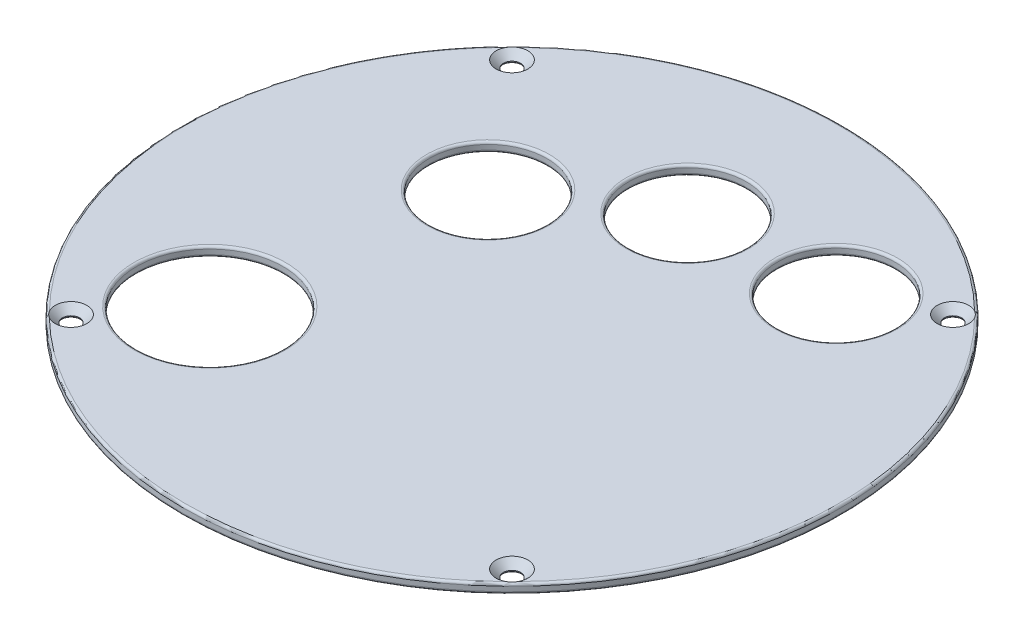
ISO-10303-21;
HEADER;
FILE_DESCRIPTION(('STEP AP214'),'2;1');
FILE_NAME('part.step','',(''),(''),'','','');
FILE_SCHEMA(('AUTOMOTIVE_DESIGN { 1 0 10303 214 1 1 1 1 }'));
ENDSEC;
DATA;
#1=APPLICATION_CONTEXT('core data for automotive mechanical design processes');
#2=APPLICATION_PROTOCOL_DEFINITION('international standard','automotive_design',2000,#1);
#3=PRODUCT_CONTEXT('',#1,'mechanical');
#4=PRODUCT('Part','Part','',(#3));
#5=PRODUCT_RELATED_PRODUCT_CATEGORY('part','',(#4));
#6=PRODUCT_DEFINITION_FORMATION('','',#4);
#7=PRODUCT_DEFINITION_CONTEXT('part definition',#1,'design');
#8=PRODUCT_DEFINITION('design','',#6,#7);
#9=PRODUCT_DEFINITION_SHAPE('','',#8);
#10=(LENGTH_UNIT() NAMED_UNIT(*) SI_UNIT(.MILLI.,.METRE.));
#11=(NAMED_UNIT(*) PLANE_ANGLE_UNIT() SI_UNIT($,.RADIAN.));
#12=(NAMED_UNIT(*) SI_UNIT($,.STERADIAN.) SOLID_ANGLE_UNIT());
#13=UNCERTAINTY_MEASURE_WITH_UNIT(LENGTH_MEASURE(1.E-05),#10,'distance_accuracy_value','');
#14=(GEOMETRIC_REPRESENTATION_CONTEXT(3) GLOBAL_UNCERTAINTY_ASSIGNED_CONTEXT((#13)) GLOBAL_UNIT_ASSIGNED_CONTEXT((#10,
#11,#12)) REPRESENTATION_CONTEXT('',''));
#15=CARTESIAN_POINT('',(0.,0.,0.));
#16=DIRECTION('',(0.,0.,1.));
#17=DIRECTION('',(1.,0.,0.));
#18=AXIS2_PLACEMENT_3D('',#15,#16,#17);
#19=CARTESIAN_POINT('',(-25.,2.,-20.));
#20=DIRECTION('',(0.,-1.,0.));
#21=DIRECTION('',(0.,0.,-1.));
#22=AXIS2_PLACEMENT_3D('',#19,#20,#21);
#23=CYLINDRICAL_SURFACE('',#22,12.3);
#24=CARTESIAN_POINT('',(-25.,0.5,-20.));
#25=DIRECTION('',(0.,1.,0.));
#26=DIRECTION('',(0.,0.,1.));
#27=AXIS2_PLACEMENT_3D('',#24,#25,#26);
#28=CIRCLE('',#27,12.3);
#29=CARTESIAN_POINT('',(-25.,0.5,-7.69999999999999));
#30=VERTEX_POINT('',#29);
#31=EDGE_CURVE('E145',#30,#30,#28,.F.);
#32=ORIENTED_EDGE('',*,*,#31,.T.);
#33=EDGE_LOOP('',(#32));
#34=FACE_BOUND('',#33,.T.);
#35=CARTESIAN_POINT('',(-25.,1.5,-20.));
#36=DIRECTION('',(0.,1.,0.));
#37=DIRECTION('',(0.,0.,1.));
#38=AXIS2_PLACEMENT_3D('',#35,#36,#37);
#39=CIRCLE('',#38,12.3);
#40=CARTESIAN_POINT('',(-25.,1.5,-7.69999999999999));
#41=VERTEX_POINT('',#40);
#42=EDGE_CURVE('E136',#41,#41,#39,.T.);
#43=ORIENTED_EDGE('',*,*,#42,.T.);
#44=EDGE_LOOP('',(#43));
#45=FACE_BOUND('',#44,.T.);
#46=ADVANCED_FACE('F43',(#34,#45),#23,.F.);
#47=CARTESIAN_POINT('',(0.,2.,-36.583123951777));
#48=DIRECTION('',(0.,-1.,0.));
#49=DIRECTION('',(0.,0.,-1.));
#50=AXIS2_PLACEMENT_3D('',#47,#48,#49);
#51=CYLINDRICAL_SURFACE('',#50,12.3);
#52=CARTESIAN_POINT('',(0.,0.5,-36.583123951777));
#53=DIRECTION('',(0.,1.,0.));
#54=DIRECTION('',(0.,0.,1.));
#55=AXIS2_PLACEMENT_3D('',#52,#53,#54);
#56=CIRCLE('',#55,12.3);
#57=CARTESIAN_POINT('',(0.,0.5,-24.283123951777));
#58=VERTEX_POINT('',#57);
#59=EDGE_CURVE('E137',#58,#58,#56,.F.);
#60=ORIENTED_EDGE('',*,*,#59,.T.);
#61=EDGE_LOOP('',(#60));
#62=FACE_BOUND('',#61,.T.);
#63=CARTESIAN_POINT('',(0.,1.5,-36.583123951777));
#64=DIRECTION('',(0.,1.,0.));
#65=DIRECTION('',(0.,0.,1.));
#66=AXIS2_PLACEMENT_3D('',#63,#64,#65);
#67=CIRCLE('',#66,12.3);
#68=CARTESIAN_POINT('',(0.,1.5,-24.283123951777));
#69=VERTEX_POINT('',#68);
#70=EDGE_CURVE('E135',#69,#69,#67,.T.);
#71=ORIENTED_EDGE('',*,*,#70,.T.);
#72=EDGE_LOOP('',(#71));
#73=FACE_BOUND('',#72,.T.);
#74=ADVANCED_FACE('F238',(#62,#73),#51,.F.);
#75=CARTESIAN_POINT('',(30.,2.,-37.583123951777));
#76=DIRECTION('',(0.,-1.,0.));
#77=DIRECTION('',(0.,0.,-1.));
#78=AXIS2_PLACEMENT_3D('',#75,#76,#77);
#79=CYLINDRICAL_SURFACE('',#78,12.3);
#80=CARTESIAN_POINT('',(30.,0.5,-37.583123951777));
#81=DIRECTION('',(0.,1.,0.));
#82=DIRECTION('',(0.,0.,1.));
#83=AXIS2_PLACEMENT_3D('',#80,#81,#82);
#84=CIRCLE('',#83,12.3);
#85=CARTESIAN_POINT('',(30.,0.5,-25.283123951777));
#86=VERTEX_POINT('',#85);
#87=EDGE_CURVE('E129',#86,#86,#84,.F.);
#88=ORIENTED_EDGE('',*,*,#87,.T.);
#89=EDGE_LOOP('',(#88));
#90=FACE_BOUND('',#89,.T.);
#91=CARTESIAN_POINT('',(30.,1.5,-37.583123951777));
#92=DIRECTION('',(0.,1.,0.));
#93=DIRECTION('',(0.,0.,1.));
#94=AXIS2_PLACEMENT_3D('',#91,#92,#93);
#95=CIRCLE('',#94,12.3);
#96=CARTESIAN_POINT('',(30.,1.5,-25.283123951777));
#97=VERTEX_POINT('',#96);
#98=EDGE_CURVE('E130',#97,#97,#95,.T.);
#99=ORIENTED_EDGE('',*,*,#98,.T.);
#100=EDGE_LOOP('',(#99));
#101=FACE_BOUND('',#100,.T.);
#102=ADVANCED_FACE('F242',(#90,#101),#79,.F.);
#103=CARTESIAN_POINT('',(-33.,2.,30.));
#104=DIRECTION('',(0.,-1.,0.));
#105=DIRECTION('',(0.,0.,-1.));
#106=AXIS2_PLACEMENT_3D('',#103,#104,#105);
#107=CYLINDRICAL_SURFACE('',#106,15.3);
#108=CARTESIAN_POINT('',(-33.,0.5,30.));
#109=DIRECTION('',(0.,1.,0.));
#110=DIRECTION('',(0.,0.,1.));
#111=AXIS2_PLACEMENT_3D('',#108,#109,#110);
#112=CIRCLE('',#111,15.3);
#113=CARTESIAN_POINT('',(-33.,0.5,45.3));
#114=VERTEX_POINT('',#113);
#115=EDGE_CURVE('E105',#114,#114,#112,.F.);
#116=ORIENTED_EDGE('',*,*,#115,.T.);
#117=EDGE_LOOP('',(#116));
#118=FACE_BOUND('',#117,.T.);
#119=CARTESIAN_POINT('',(-33.,1.5,30.));
#120=DIRECTION('',(0.,1.,0.));
#121=DIRECTION('',(0.,0.,1.));
#122=AXIS2_PLACEMENT_3D('',#119,#120,#121);
#123=CIRCLE('',#122,15.3);
#124=CARTESIAN_POINT('',(-33.,1.5,45.3));
#125=VERTEX_POINT('',#124);
#126=EDGE_CURVE('E110',#125,#125,#123,.T.);
#127=ORIENTED_EDGE('',*,*,#126,.T.);
#128=EDGE_LOOP('',(#127));
#129=FACE_BOUND('',#128,.T.);
#130=ADVANCED_FACE('F251',(#118,#129),#107,.F.);
#131=CARTESIAN_POINT('',(0.,2.,0.));
#132=DIRECTION('',(0.,-1.,0.));
#133=DIRECTION('',(0.,0.,-1.));
#134=AXIS2_PLACEMENT_3D('',#131,#132,#133);
#135=CYLINDRICAL_SURFACE('',#134,68.7);
#136=CARTESIAN_POINT('',(0.,0.5,0.));
#137=DIRECTION('',(0.,1.,0.));
#138=DIRECTION('',(0.,0.,1.));
#139=AXIS2_PLACEMENT_3D('',#136,#137,#138);
#140=CIRCLE('',#139,68.7);
#141=CARTESIAN_POINT('',(0.,0.5,68.7));
#142=VERTEX_POINT('',#141);
#143=EDGE_CURVE('E147',#142,#142,#140,.T.);
#144=ORIENTED_EDGE('',*,*,#143,.T.);
#145=EDGE_LOOP('',(#144));
#146=FACE_BOUND('',#145,.T.);
#147=CARTESIAN_POINT('',(0.,1.5,0.));
#148=DIRECTION('',(0.,1.,0.));
#149=DIRECTION('',(0.,0.,1.));
#150=AXIS2_PLACEMENT_3D('',#147,#148,#149);
#151=CIRCLE('',#150,68.7);
#152=CARTESIAN_POINT('',(0.,1.5,68.7));
#153=VERTEX_POINT('',#152);
#154=EDGE_CURVE('E143',#153,#153,#151,.F.);
#155=ORIENTED_EDGE('',*,*,#154,.T.);
#156=EDGE_LOOP('',(#155));
#157=FACE_BOUND('',#156,.T.);
#158=ADVANCED_FACE('F248',(#146,#157),#135,.T.);
#159=CARTESIAN_POINT('',(0.,2.,0.));
#160=DIRECTION('',(0.,1.,0.));
#161=DIRECTION('',(0.,0.,1.));
#162=AXIS2_PLACEMENT_3D('',#159,#160,#161);
#163=PLANE('',#162);
#164=CARTESIAN_POINT('',(-33.,2.,30.));
#165=DIRECTION('',(0.,1.,0.));
#166=DIRECTION('',(0.,0.,1.));
#167=AXIS2_PLACEMENT_3D('',#164,#165,#166);
#168=CIRCLE('',#167,15.8);
#169=CARTESIAN_POINT('',(-33.,2.,45.8));
#170=VERTEX_POINT('',#169);
#171=EDGE_CURVE('E121',#170,#170,#168,.F.);
#172=ORIENTED_EDGE('',*,*,#171,.T.);
#173=EDGE_LOOP('',(#172));
#174=FACE_BOUND('',#173,.T.);
#175=CARTESIAN_POINT('',(30.,2.,-37.583123951777));
#176=DIRECTION('',(0.,1.,0.));
#177=DIRECTION('',(0.,0.,1.));
#178=AXIS2_PLACEMENT_3D('',#175,#176,#177);
#179=CIRCLE('',#178,12.8);
#180=CARTESIAN_POINT('',(30.,2.,-24.783123951777));
#181=VERTEX_POINT('',#180);
#182=EDGE_CURVE('E122',#181,#181,#179,.F.);
#183=ORIENTED_EDGE('',*,*,#182,.T.);
#184=EDGE_LOOP('',(#183));
#185=FACE_BOUND('',#184,.T.);
#186=CARTESIAN_POINT('',(0.,2.,-36.583123951777));
#187=DIRECTION('',(0.,1.,0.));
#188=DIRECTION('',(0.,0.,1.));
#189=AXIS2_PLACEMENT_3D('',#186,#187,#188);
#190=CIRCLE('',#189,12.8);
#191=CARTESIAN_POINT('',(0.,2.,-23.783123951777));
#192=VERTEX_POINT('',#191);
#193=EDGE_CURVE('E117',#192,#192,#190,.F.);
#194=ORIENTED_EDGE('',*,*,#193,.T.);
#195=EDGE_LOOP('',(#194));
#196=FACE_BOUND('',#195,.T.);
#197=CARTESIAN_POINT('',(-25.,2.,-20.));
#198=DIRECTION('',(0.,1.,0.));
#199=DIRECTION('',(0.,0.,1.));
#200=AXIS2_PLACEMENT_3D('',#197,#198,#199);
#201=CIRCLE('',#200,12.8);
#202=CARTESIAN_POINT('',(-25.,2.,-7.19999999999999));
#203=VERTEX_POINT('',#202);
#204=EDGE_CURVE('E114',#203,#203,#201,.F.);
#205=ORIENTED_EDGE('',*,*,#204,.T.);
#206=EDGE_LOOP('',(#205));
#207=FACE_BOUND('',#206,.T.);
#208=CARTESIAN_POINT('',(45.9619407771255,2.,-45.9619407771257));
#209=DIRECTION('',(0.,1.,0.));
#210=DIRECTION('',(0.,0.,1.));
#211=AXIS2_PLACEMENT_3D('',#208,#209,#210);
#212=CIRCLE('',#211,3.3);
#213=CARTESIAN_POINT('',(48.8050882928111,2.,-47.6372055932221));
#214=VERTEX_POINT('',#213);
#215=CARTESIAN_POINT('',(47.6372055932219,2.,-48.8050882928113));
#216=VERTEX_POINT('',#215);
#217=EDGE_CURVE('E339',#214,#216,#212,.F.);
#218=ORIENTED_EDGE('',*,*,#217,.T.);
#219=CARTESIAN_POINT('',(0.,2.,0.));
#220=DIRECTION('',(0.,1.,0.));
#221=DIRECTION('',(0.,0.,1.));
#222=AXIS2_PLACEMENT_3D('',#219,#220,#221);
#223=CIRCLE('',#222,68.2);
#224=CARTESIAN_POINT('',(-47.6372055932221,2.,-48.8050882928111));
#225=VERTEX_POINT('',#224);
#226=EDGE_CURVE('E115',#216,#225,#223,.T.);
#227=ORIENTED_EDGE('',*,*,#226,.T.);
#228=CARTESIAN_POINT('',(-45.9619407771257,2.,-45.9619407771255));
#229=DIRECTION('',(0.,1.,0.));
#230=DIRECTION('',(0.,0.,1.));
#231=AXIS2_PLACEMENT_3D('',#228,#229,#230);
#232=CIRCLE('',#231,3.3);
#233=CARTESIAN_POINT('',(-48.8050882928113,2.,-47.6372055932219));
#234=VERTEX_POINT('',#233);
#235=EDGE_CURVE('E337',#225,#234,#232,.F.);
#236=ORIENTED_EDGE('',*,*,#235,.T.);
#237=CARTESIAN_POINT('',(0.,2.,0.));
#238=DIRECTION('',(0.,1.,0.));
#239=DIRECTION('',(0.,0.,1.));
#240=AXIS2_PLACEMENT_3D('',#237,#238,#239);
#241=CIRCLE('',#240,68.2);
#242=CARTESIAN_POINT('',(-48.8050882928113,2.,47.6372055932219));
#243=VERTEX_POINT('',#242);
#244=EDGE_CURVE('E104',#234,#243,#241,.T.);
#245=ORIENTED_EDGE('',*,*,#244,.T.);
#246=CARTESIAN_POINT('',(-45.9619407771255,2.,45.9619407771257));
#247=DIRECTION('',(0.,1.,0.));
#248=DIRECTION('',(0.,0.,1.));
#249=AXIS2_PLACEMENT_3D('',#246,#247,#248);
#250=CIRCLE('',#249,3.30000000000005);
#251=CARTESIAN_POINT('',(-47.6372055932217,2.,48.8050882928115));
#252=VERTEX_POINT('',#251);
#253=EDGE_CURVE('E100',#243,#252,#250,.F.);
#254=ORIENTED_EDGE('',*,*,#253,.T.);
#255=CARTESIAN_POINT('',(0.,2.,0.));
#256=DIRECTION('',(0.,1.,0.));
#257=DIRECTION('',(0.,0.,1.));
#258=AXIS2_PLACEMENT_3D('',#255,#256,#257);
#259=CIRCLE('',#258,68.2);
#260=CARTESIAN_POINT('',(47.6372055932221,2.,48.8050882928112));
#261=VERTEX_POINT('',#260);
#262=EDGE_CURVE('E97',#252,#261,#259,.T.);
#263=ORIENTED_EDGE('',*,*,#262,.T.);
#264=CARTESIAN_POINT('',(45.9619407771257,2.,45.9619407771255));
#265=DIRECTION('',(0.,1.,0.));
#266=DIRECTION('',(0.,0.,1.));
#267=AXIS2_PLACEMENT_3D('',#264,#265,#266);
#268=CIRCLE('',#267,3.3);
#269=CARTESIAN_POINT('',(48.8050882928114,2.,47.6372055932218));
#270=VERTEX_POINT('',#269);
#271=EDGE_CURVE('E92',#261,#270,#268,.F.);
#272=ORIENTED_EDGE('',*,*,#271,.T.);
#273=CARTESIAN_POINT('',(0.,2.,0.));
#274=DIRECTION('',(0.,1.,0.));
#275=DIRECTION('',(0.,0.,1.));
#276=AXIS2_PLACEMENT_3D('',#273,#274,#275);
#277=CIRCLE('',#276,68.2);
#278=EDGE_CURVE('E63',#270,#214,#277,.T.);
#279=ORIENTED_EDGE('',*,*,#278,.T.);
#280=EDGE_LOOP('',(#218,#227,#236,#245,#254,#263,#272,#279));
#281=FACE_BOUND('',#280,.T.);
#282=ADVANCED_FACE('F93',(#174,#185,#196,#207,#281),#163,.T.);
#283=CARTESIAN_POINT('',(0.,0.,0.));
#284=DIRECTION('',(0.,1.,0.));
#285=DIRECTION('',(0.,0.,1.));
#286=AXIS2_PLACEMENT_3D('',#283,#284,#285);
#287=PLANE('',#286);
#288=CARTESIAN_POINT('',(-45.9619407771257,0.,-45.9619407771255));
#289=DIRECTION('',(0.,1.,0.));
#290=DIRECTION('',(0.,0.,1.));
#291=AXIS2_PLACEMENT_3D('',#288,#289,#290);
#292=CIRCLE('',#291,2.3);
#293=CARTESIAN_POINT('',(-45.9619407771257,0.,-43.6619407771255));
#294=VERTEX_POINT('',#293);
#295=EDGE_CURVE('E281',#294,#294,#292,.T.);
#296=ORIENTED_EDGE('',*,*,#295,.T.);
#297=EDGE_LOOP('',(#296));
#298=FACE_BOUND('',#297,.T.);
#299=CARTESIAN_POINT('',(45.9619407771255,0.,-45.9619407771257));
#300=DIRECTION('',(0.,1.,0.));
#301=DIRECTION('',(0.,0.,1.));
#302=AXIS2_PLACEMENT_3D('',#299,#300,#301);
#303=CIRCLE('',#302,2.29999999999999);
#304=CARTESIAN_POINT('',(45.9619407771255,0.,-43.6619407771257));
#305=VERTEX_POINT('',#304);
#306=EDGE_CURVE('E287',#305,#305,#303,.T.);
#307=ORIENTED_EDGE('',*,*,#306,.T.);
#308=EDGE_LOOP('',(#307));
#309=FACE_BOUND('',#308,.T.);
#310=CARTESIAN_POINT('',(45.9619407771257,0.,45.9619407771255));
#311=DIRECTION('',(0.,1.,0.));
#312=DIRECTION('',(0.,0.,1.));
#313=AXIS2_PLACEMENT_3D('',#310,#311,#312);
#314=CIRCLE('',#313,2.3);
#315=CARTESIAN_POINT('',(45.9619407771257,0.,48.2619407771255));
#316=VERTEX_POINT('',#315);
#317=EDGE_CURVE('E288',#316,#316,#314,.T.);
#318=ORIENTED_EDGE('',*,*,#317,.T.);
#319=EDGE_LOOP('',(#318));
#320=FACE_BOUND('',#319,.T.);
#321=CARTESIAN_POINT('',(-45.9619407771255,0.,45.9619407771257));
#322=DIRECTION('',(0.,1.,0.));
#323=DIRECTION('',(0.,0.,1.));
#324=AXIS2_PLACEMENT_3D('',#321,#322,#323);
#325=CIRCLE('',#324,2.3);
#326=CARTESIAN_POINT('',(-45.9619407771255,0.,48.2619407771257));
#327=VERTEX_POINT('',#326);
#328=EDGE_CURVE('E295',#327,#327,#325,.T.);
#329=ORIENTED_EDGE('',*,*,#328,.T.);
#330=EDGE_LOOP('',(#329));
#331=FACE_BOUND('',#330,.T.);
#332=CARTESIAN_POINT('',(-33.,0.,30.));
#333=DIRECTION('',(0.,1.,0.));
#334=DIRECTION('',(0.,0.,1.));
#335=AXIS2_PLACEMENT_3D('',#332,#333,#334);
#336=CIRCLE('',#335,15.8);
#337=CARTESIAN_POINT('',(-33.,0.,45.8));
#338=VERTEX_POINT('',#337);
#339=EDGE_CURVE('E296',#338,#338,#336,.T.);
#340=ORIENTED_EDGE('',*,*,#339,.T.);
#341=EDGE_LOOP('',(#340));
#342=FACE_BOUND('',#341,.T.);
#343=CARTESIAN_POINT('',(30.,0.,-37.583123951777));
#344=DIRECTION('',(0.,1.,0.));
#345=DIRECTION('',(0.,0.,1.));
#346=AXIS2_PLACEMENT_3D('',#343,#344,#345);
#347=CIRCLE('',#346,12.8);
#348=CARTESIAN_POINT('',(30.,0.,-24.783123951777));
#349=VERTEX_POINT('',#348);
#350=EDGE_CURVE('E305',#349,#349,#347,.T.);
#351=ORIENTED_EDGE('',*,*,#350,.T.);
#352=EDGE_LOOP('',(#351));
#353=FACE_BOUND('',#352,.T.);
#354=CARTESIAN_POINT('',(0.,0.,-36.583123951777));
#355=DIRECTION('',(0.,1.,0.));
#356=DIRECTION('',(0.,0.,1.));
#357=AXIS2_PLACEMENT_3D('',#354,#355,#356);
#358=CIRCLE('',#357,12.8);
#359=CARTESIAN_POINT('',(0.,0.,-23.783123951777));
#360=VERTEX_POINT('',#359);
#361=EDGE_CURVE('E306',#360,#360,#358,.T.);
#362=ORIENTED_EDGE('',*,*,#361,.T.);
#363=EDGE_LOOP('',(#362));
#364=FACE_BOUND('',#363,.T.);
#365=CARTESIAN_POINT('',(-25.,0.,-20.));
#366=DIRECTION('',(0.,1.,0.));
#367=DIRECTION('',(0.,0.,1.));
#368=AXIS2_PLACEMENT_3D('',#365,#366,#367);
#369=CIRCLE('',#368,12.8);
#370=CARTESIAN_POINT('',(-25.,0.,-7.19999999999999));
#371=VERTEX_POINT('',#370);
#372=EDGE_CURVE('E309',#371,#371,#369,.T.);
#373=ORIENTED_EDGE('',*,*,#372,.T.);
#374=EDGE_LOOP('',(#373));
#375=FACE_BOUND('',#374,.T.);
#376=CARTESIAN_POINT('',(0.,0.,0.));
#377=DIRECTION('',(0.,1.,0.));
#378=DIRECTION('',(0.,0.,1.));
#379=AXIS2_PLACEMENT_3D('',#376,#377,#378);
#380=CIRCLE('',#379,68.2);
#381=CARTESIAN_POINT('',(0.,0.,68.2));
#382=VERTEX_POINT('',#381);
#383=EDGE_CURVE('E315',#382,#382,#380,.F.);
#384=ORIENTED_EDGE('',*,*,#383,.T.);
#385=EDGE_LOOP('',(#384));
#386=FACE_BOUND('',#385,.T.);
#387=ADVANCED_FACE('F265',(#298,#309,#320,#331,#342,#353,#364,#375,#386),#287,.F.);
#388=CARTESIAN_POINT('',(45.9619407771257,0.499999999999998,45.9619407771255));
#389=DIRECTION('',(0.,1.,0.));
#390=DIRECTION('',(0.,0.,1.));
#391=AXIS2_PLACEMENT_3D('',#388,#389,#390);
#392=CONICAL_SURFACE('',#391,1.8,0.785398163397446);
#393=ORIENTED_EDGE('',*,*,#271,.F.);
#394=CARTESIAN_POINT('',(47.6372055932221,2.,48.8050882928112));
#395=CARTESIAN_POINT('',(47.6740464478229,1.9999811247721,48.7833590423543));
#396=CARTESIAN_POINT('',(47.7103130939881,1.99968917662758,48.7606854592024));
#397=CARTESIAN_POINT('',(47.7817443673706,1.99879279597853,48.7136992289782));
#398=CARTESIAN_POINT('',(47.8169094708241,1.99818850054701,48.6893873049555));
#399=CARTESIAN_POINT('',(47.8861879554743,1.99690118670441,48.6393749488298));
#400=CARTESIAN_POINT('',(47.9203021721129,1.99621823298587,48.6136756668733));
#401=CARTESIAN_POINT('',(47.9875458438673,1.99490986978549,48.5610135299329));
#402=CARTESIAN_POINT('',(48.0206751663623,1.99428446802977,48.5340505060281));
#403=CARTESIAN_POINT('',(48.1175332151025,1.99267159999916,48.4523542307601));
#404=CARTESIAN_POINT('',(48.179885694323,1.99191849460715,48.3959705337135));
#405=CARTESIAN_POINT('',(48.300801289528,1.99139094210692,48.279277920543));
#406=CARTESIAN_POINT('',(48.359363661867,1.99161668646857,48.2189682387416));
#407=CARTESIAN_POINT('',(48.4883947102676,1.99316519387139,48.0770237329607));
#408=CARTESIAN_POINT('',(48.5575498120295,1.99478000724619,47.9941797302876));
#409=CARTESIAN_POINT('',(48.6553648198592,1.99730763206586,47.8647474163772));
#410=CARTESIAN_POINT('',(48.6871349563034,1.99817258027716,47.8204952907471));
#411=CARTESIAN_POINT('',(48.7481363027266,1.99949910981338,47.7302106668988));
#412=CARTESIAN_POINT('',(48.7773649846612,1.99996029354674,47.6841764603058));
#413=CARTESIAN_POINT('',(48.8050882928114,2.,47.6372055932218));
#414=B_SPLINE_CURVE_WITH_KNOTS('',3,(#394,#395,#396,#397,#398,#399,#400,#401,#402,#403,#404,
#405,#406,#407,#408,#409,#410,#411,#412,#413),.UNSPECIFIED.,.F.,.F.,(4,2,2,2,2,2,2,2,2,4),(0.,
0.128278274042397,0.256500301144603,0.38461761508339,0.512752103224905,0.76474287859845,
1.0167829473601,1.34006550895153,1.50343700988058,1.66696920426331),.UNSPECIFIED.);
#415=EDGE_CURVE('E60',#261,#270,#414,.T.);
#416=ORIENTED_EDGE('',*,*,#415,.T.);
#417=EDGE_LOOP('',(#393,#416));
#418=FACE_BOUND('',#417,.T.);
#419=CARTESIAN_POINT('',(45.9619407771257,0.499999999999998,45.9619407771255));
#420=DIRECTION('',(0.,1.,0.));
#421=DIRECTION('',(0.,0.,1.));
#422=AXIS2_PLACEMENT_3D('',#419,#420,#421);
#423=CIRCLE('',#422,1.8);
#424=CARTESIAN_POINT('',(45.9619407771257,0.499999999999998,47.7619407771255));
#425=VERTEX_POINT('',#424);
#426=EDGE_CURVE('E341',#425,#425,#423,.T.);
#427=ORIENTED_EDGE('',*,*,#426,.F.);
#428=EDGE_LOOP('',(#427));
#429=FACE_BOUND('',#428,.T.);
#430=ADVANCED_FACE('F88',(#418,#429),#392,.F.);
#431=CARTESIAN_POINT('',(-45.9619407771255,0.49999999999997,45.9619407771257));
#432=DIRECTION('',(0.,1.,0.));
#433=DIRECTION('',(0.,0.,1.));
#434=AXIS2_PLACEMENT_3D('',#431,#432,#433);
#435=CONICAL_SURFACE('',#434,1.8,0.785398163397455);
#436=ORIENTED_EDGE('',*,*,#253,.F.);
#437=CARTESIAN_POINT('',(-48.8050882928113,2.,47.6372055932219));
#438=CARTESIAN_POINT('',(-48.7833590423545,1.9999811247721,47.6740464478227));
#439=CARTESIAN_POINT('',(-48.7606854592025,1.99968917662758,47.7103130939879));
#440=CARTESIAN_POINT('',(-48.7136992289784,1.99879279597853,47.7817443673705));
#441=CARTESIAN_POINT('',(-48.6893873049556,1.99818850054701,47.8169094708239));
#442=CARTESIAN_POINT('',(-48.63937494883,1.99690118670441,47.8861879554741));
#443=CARTESIAN_POINT('',(-48.6136756668735,1.99621823298587,47.9203021721127));
#444=CARTESIAN_POINT('',(-48.5610135299331,1.99490986978549,47.9875458438672));
#445=CARTESIAN_POINT('',(-48.5340505060283,1.99428446802976,48.0206751663622));
#446=CARTESIAN_POINT('',(-48.4523542307603,1.99267159999915,48.1175332151023));
#447=CARTESIAN_POINT('',(-48.3959705337137,1.99191849460715,48.1798856943228));
#448=CARTESIAN_POINT('',(-48.2792779205432,1.99139094210691,48.3008012895278));
#449=CARTESIAN_POINT('',(-48.2189682387418,1.99161668646856,48.3593636618668));
#450=CARTESIAN_POINT('',(-48.0770237329608,1.99316519387138,48.4883947102676));
#451=CARTESIAN_POINT('',(-47.9941797302877,1.99478000724618,48.5575498120295));
#452=CARTESIAN_POINT('',(-47.8647474163772,1.99730763206586,48.6553648198593));
#453=CARTESIAN_POINT('',(-47.8204952907471,1.99817258027716,48.6871349563034));
#454=CARTESIAN_POINT('',(-47.7302106668987,1.99949910981338,48.7481363027267));
#455=CARTESIAN_POINT('',(-47.6841764603057,1.99996029354674,48.7773649846613));
#456=CARTESIAN_POINT('',(-47.6372055932217,2.,48.8050882928115));
#457=B_SPLINE_CURVE_WITH_KNOTS('',3,(#437,#438,#439,#440,#441,#442,#443,#444,#445,#446,#447,
#448,#449,#450,#451,#452,#453,#454,#455,#456),.UNSPECIFIED.,.F.,.F.,(4,2,2,2,2,2,2,2,2,4),(0.,
0.128278274042393,0.256500301144595,0.38461761508338,0.51275210322489,0.764742878598431,
1.01678294736008,1.34006550895175,1.50343700988092,1.66696920426377),.UNSPECIFIED.);
#458=EDGE_CURVE('E91',#243,#252,#457,.T.);
#459=ORIENTED_EDGE('',*,*,#458,.T.);
#460=EDGE_LOOP('',(#436,#459));
#461=FACE_BOUND('',#460,.T.);
#462=CARTESIAN_POINT('',(-45.9619407771255,0.49999999999997,45.9619407771257));
#463=DIRECTION('',(0.,1.,0.));
#464=DIRECTION('',(0.,0.,1.));
#465=AXIS2_PLACEMENT_3D('',#462,#463,#464);
#466=CIRCLE('',#465,1.8);
#467=CARTESIAN_POINT('',(-45.9619407771255,0.49999999999997,47.7619407771257));
#468=VERTEX_POINT('',#467);
#469=EDGE_CURVE('E96',#468,#468,#466,.T.);
#470=ORIENTED_EDGE('',*,*,#469,.F.);
#471=EDGE_LOOP('',(#470));
#472=FACE_BOUND('',#471,.T.);
#473=ADVANCED_FACE('F175',(#461,#472),#435,.F.);
#474=CARTESIAN_POINT('',(-45.9619407771257,0.499999999999998,-45.9619407771255));
#475=DIRECTION('',(0.,1.,0.));
#476=DIRECTION('',(0.,0.,1.));
#477=AXIS2_PLACEMENT_3D('',#474,#475,#476);
#478=CONICAL_SURFACE('',#477,1.8,0.785398163397446);
#479=ORIENTED_EDGE('',*,*,#235,.F.);
#480=CARTESIAN_POINT('',(-47.6372055932221,2.,-48.8050882928111));
#481=CARTESIAN_POINT('',(-47.6740464478229,1.9999811247721,-48.7833590423543));
#482=CARTESIAN_POINT('',(-47.7103130939882,1.99968917662758,-48.7606854592023));
#483=CARTESIAN_POINT('',(-47.7817443673707,1.99879279597853,-48.7136992289782));
#484=CARTESIAN_POINT('',(-47.8169094708241,1.99818850054701,-48.6893873049554));
#485=CARTESIAN_POINT('',(-47.8861879554744,1.99690118670441,-48.6393749488298));
#486=CARTESIAN_POINT('',(-47.920302172113,1.99621823298587,-48.6136756668733));
#487=CARTESIAN_POINT('',(-47.9875458438674,1.99490986978549,-48.5610135299328));
#488=CARTESIAN_POINT('',(-48.0206751663624,1.99428446802977,-48.534050506028));
#489=CARTESIAN_POINT('',(-48.1175332151026,1.99267159999916,-48.45235423076));
#490=CARTESIAN_POINT('',(-48.1798856943231,1.99191849460715,-48.3959705337134));
#491=CARTESIAN_POINT('',(-48.3008012895281,1.99139094210692,-48.2792779205429));
#492=CARTESIAN_POINT('',(-48.3593636618671,1.99161668646857,-48.2189682387415));
#493=CARTESIAN_POINT('',(-48.4883947102677,1.99316519387139,-48.0770237329606));
#494=CARTESIAN_POINT('',(-48.5575498120296,1.99478000724619,-47.9941797302875));
#495=CARTESIAN_POINT('',(-48.6553648198592,1.99730763206586,-47.8647474163772));
#496=CARTESIAN_POINT('',(-48.6871349563034,1.99817258027716,-47.8204952907471));
#497=CARTESIAN_POINT('',(-48.7481363027266,1.99949910981338,-47.7302106668988));
#498=CARTESIAN_POINT('',(-48.7773649846612,1.99996029354674,-47.6841764603058));
#499=CARTESIAN_POINT('',(-48.8050882928113,2.,-47.6372055932219));
#500=B_SPLINE_CURVE_WITH_KNOTS('',3,(#480,#481,#482,#483,#484,#485,#486,#487,#488,#489,#490,
#491,#492,#493,#494,#495,#496,#497,#498,#499),.UNSPECIFIED.,.F.,.F.,(4,2,2,2,2,2,2,2,2,4),(0.,
0.128278274042416,0.256500301144638,0.384617615083444,0.512752103224973,0.764742878598542,
1.01678294736021,1.34006550895153,1.50343700988053,1.6669692042632),.UNSPECIFIED.);
#501=EDGE_CURVE('E154',#225,#234,#500,.T.);
#502=ORIENTED_EDGE('',*,*,#501,.T.);
#503=EDGE_LOOP('',(#479,#502));
#504=FACE_BOUND('',#503,.T.);
#505=CARTESIAN_POINT('',(-45.9619407771257,0.499999999999998,-45.9619407771255));
#506=DIRECTION('',(0.,1.,0.));
#507=DIRECTION('',(0.,0.,1.));
#508=AXIS2_PLACEMENT_3D('',#505,#506,#507);
#509=CIRCLE('',#508,1.8);
#510=CARTESIAN_POINT('',(-45.9619407771257,0.499999999999998,-44.1619407771255));
#511=VERTEX_POINT('',#510);
#512=EDGE_CURVE('E320',#511,#511,#509,.T.);
#513=ORIENTED_EDGE('',*,*,#512,.F.);
#514=EDGE_LOOP('',(#513));
#515=FACE_BOUND('',#514,.T.);
#516=ADVANCED_FACE('F165',(#504,#515),#478,.F.);
#517=CARTESIAN_POINT('',(45.9619407771255,0.499999999999982,-45.9619407771257));
#518=DIRECTION('',(0.,1.,0.));
#519=DIRECTION('',(0.,0.,1.));
#520=AXIS2_PLACEMENT_3D('',#517,#518,#519);
#521=CONICAL_SURFACE('',#520,1.79999999999999,0.785398163397446);
#522=ORIENTED_EDGE('',*,*,#217,.F.);
#523=CARTESIAN_POINT('',(48.8050882928111,2.,-47.6372055932221));
#524=CARTESIAN_POINT('',(48.7833590423543,1.9999811247721,-47.6740464478229));
#525=CARTESIAN_POINT('',(48.7606854592023,1.99968917662758,-47.7103130939882));
#526=CARTESIAN_POINT('',(48.7136992289782,1.99879279597853,-47.7817443673707));
#527=CARTESIAN_POINT('',(48.6893873049554,1.99818850054701,-47.8169094708241));
#528=CARTESIAN_POINT('',(48.6393749488298,1.99690118670441,-47.8861879554744));
#529=CARTESIAN_POINT('',(48.6136756668733,1.99621823298587,-47.920302172113));
#530=CARTESIAN_POINT('',(48.5610135299328,1.99490986978549,-47.9875458438674));
#531=CARTESIAN_POINT('',(48.534050506028,1.99428446802977,-48.0206751663624));
#532=CARTESIAN_POINT('',(48.45235423076,1.99267159999916,-48.1175332151025));
#533=CARTESIAN_POINT('',(48.3959705337134,1.99191849460715,-48.1798856943231));
#534=CARTESIAN_POINT('',(48.2792779205429,1.99139094210692,-48.3008012895281));
#535=CARTESIAN_POINT('',(48.2189682387415,1.99161668646857,-48.3593636618671));
#536=CARTESIAN_POINT('',(48.0770237329606,1.99316519387139,-48.4883947102677));
#537=CARTESIAN_POINT('',(47.9941797302875,1.99478000724619,-48.5575498120296));
#538=CARTESIAN_POINT('',(47.8647474163772,1.99730763206586,-48.6553648198592));
#539=CARTESIAN_POINT('',(47.8204952907471,1.99817258027716,-48.6871349563034));
#540=CARTESIAN_POINT('',(47.7302106668988,1.99949910981338,-48.7481363027266));
#541=CARTESIAN_POINT('',(47.6841764603058,1.99996029354674,-48.7773649846612));
#542=CARTESIAN_POINT('',(47.6372055932219,2.,-48.8050882928113));
#543=B_SPLINE_CURVE_WITH_KNOTS('',3,(#523,#524,#525,#526,#527,#528,#529,#530,#531,#532,#533,
#534,#535,#536,#537,#538,#539,#540,#541,#542),.UNSPECIFIED.,.F.,.F.,(4,2,2,2,2,2,2,2,2,4),(0.,
0.128278274042416,0.256500301144638,0.38461761508345,0.512752103224973,0.764742878598532,
1.01678294736021,1.34006550895153,1.50343700988053,1.6669692042632),.UNSPECIFIED.);
#544=EDGE_CURVE('E11',#214,#216,#543,.T.);
#545=ORIENTED_EDGE('',*,*,#544,.T.);
#546=EDGE_LOOP('',(#522,#545));
#547=FACE_BOUND('',#546,.T.);
#548=CARTESIAN_POINT('',(45.9619407771255,0.499999999999983,-45.9619407771257));
#549=DIRECTION('',(0.,1.,0.));
#550=DIRECTION('',(0.,0.,1.));
#551=AXIS2_PLACEMENT_3D('',#548,#549,#550);
#552=CIRCLE('',#551,1.79999999999999);
#553=CARTESIAN_POINT('',(45.9619407771255,0.499999999999983,-44.1619407771257));
#554=VERTEX_POINT('',#553);
#555=EDGE_CURVE('E312',#554,#554,#552,.T.);
#556=ORIENTED_EDGE('',*,*,#555,.F.);
#557=EDGE_LOOP('',(#556));
#558=FACE_BOUND('',#557,.T.);
#559=ADVANCED_FACE('F171',(#547,#558),#521,.F.);
#560=CARTESIAN_POINT('',(-45.9619407771257,0.5,-45.9619407771255));
#561=DIRECTION('',(0.,1.,0.));
#562=DIRECTION('',(0.,0.,1.));
#563=AXIS2_PLACEMENT_3D('',#560,#561,#562);
#564=TOROIDAL_SURFACE('',#563,2.3,0.5);
#565=ORIENTED_EDGE('',*,*,#512,.T.);
#566=EDGE_LOOP('',(#565));
#567=FACE_BOUND('',#566,.T.);
#568=ORIENTED_EDGE('',*,*,#295,.F.);
#569=EDGE_LOOP('',(#568));
#570=FACE_BOUND('',#569,.T.);
#571=ADVANCED_FACE('F181',(#567,#570),#564,.T.);
#572=CARTESIAN_POINT('',(45.9619407771255,0.5,-45.9619407771257));
#573=DIRECTION('',(0.,1.,0.));
#574=DIRECTION('',(0.,0.,1.));
#575=AXIS2_PLACEMENT_3D('',#572,#573,#574);
#576=TOROIDAL_SURFACE('',#575,2.29999999999999,0.5);
#577=ORIENTED_EDGE('',*,*,#555,.T.);
#578=EDGE_LOOP('',(#577));
#579=FACE_BOUND('',#578,.T.);
#580=ORIENTED_EDGE('',*,*,#306,.F.);
#581=EDGE_LOOP('',(#580));
#582=FACE_BOUND('',#581,.T.);
#583=ADVANCED_FACE('F183',(#579,#582),#576,.T.);
#584=CARTESIAN_POINT('',(45.9619407771257,0.5,45.9619407771255));
#585=DIRECTION('',(0.,1.,0.));
#586=DIRECTION('',(0.,0.,1.));
#587=AXIS2_PLACEMENT_3D('',#584,#585,#586);
#588=TOROIDAL_SURFACE('',#587,2.3,0.5);
#589=ORIENTED_EDGE('',*,*,#426,.T.);
#590=EDGE_LOOP('',(#589));
#591=FACE_BOUND('',#590,.T.);
#592=ORIENTED_EDGE('',*,*,#317,.F.);
#593=EDGE_LOOP('',(#592));
#594=FACE_BOUND('',#593,.T.);
#595=ADVANCED_FACE('F189',(#591,#594),#588,.T.);
#596=CARTESIAN_POINT('',(-45.9619407771255,0.5,45.9619407771257));
#597=DIRECTION('',(0.,1.,0.));
#598=DIRECTION('',(0.,0.,1.));
#599=AXIS2_PLACEMENT_3D('',#596,#597,#598);
#600=TOROIDAL_SURFACE('',#599,2.3,0.5);
#601=ORIENTED_EDGE('',*,*,#469,.T.);
#602=EDGE_LOOP('',(#601));
#603=FACE_BOUND('',#602,.T.);
#604=ORIENTED_EDGE('',*,*,#328,.F.);
#605=EDGE_LOOP('',(#604));
#606=FACE_BOUND('',#605,.T.);
#607=ADVANCED_FACE('F195',(#603,#606),#600,.T.);
#608=CARTESIAN_POINT('',(-33.,0.5,30.));
#609=DIRECTION('',(0.,1.,0.));
#610=DIRECTION('',(0.,0.,1.));
#611=AXIS2_PLACEMENT_3D('',#608,#609,#610);
#612=TOROIDAL_SURFACE('',#611,15.8,0.5);
#613=ORIENTED_EDGE('',*,*,#115,.F.);
#614=EDGE_LOOP('',(#613));
#615=FACE_BOUND('',#614,.T.);
#616=ORIENTED_EDGE('',*,*,#339,.F.);
#617=EDGE_LOOP('',(#616));
#618=FACE_BOUND('',#617,.T.);
#619=ADVANCED_FACE('F199',(#615,#618),#612,.T.);
#620=CARTESIAN_POINT('',(-33.,1.5,30.));
#621=DIRECTION('',(0.,1.,0.));
#622=DIRECTION('',(0.,0.,1.));
#623=AXIS2_PLACEMENT_3D('',#620,#621,#622);
#624=TOROIDAL_SURFACE('',#623,15.8,0.5);
#625=ORIENTED_EDGE('',*,*,#171,.F.);
#626=EDGE_LOOP('',(#625));
#627=FACE_BOUND('',#626,.T.);
#628=ORIENTED_EDGE('',*,*,#126,.F.);
#629=EDGE_LOOP('',(#628));
#630=FACE_BOUND('',#629,.T.);
#631=ADVANCED_FACE('F197',(#627,#630),#624,.T.);
#632=CARTESIAN_POINT('',(30.,0.5,-37.583123951777));
#633=DIRECTION('',(0.,1.,0.));
#634=DIRECTION('',(0.,0.,1.));
#635=AXIS2_PLACEMENT_3D('',#632,#633,#634);
#636=TOROIDAL_SURFACE('',#635,12.8,0.5);
#637=ORIENTED_EDGE('',*,*,#87,.F.);
#638=EDGE_LOOP('',(#637));
#639=FACE_BOUND('',#638,.T.);
#640=ORIENTED_EDGE('',*,*,#350,.F.);
#641=EDGE_LOOP('',(#640));
#642=FACE_BOUND('',#641,.T.);
#643=ADVANCED_FACE('F201',(#639,#642),#636,.T.);
#644=CARTESIAN_POINT('',(30.,1.5,-37.583123951777));
#645=DIRECTION('',(0.,1.,0.));
#646=DIRECTION('',(0.,0.,1.));
#647=AXIS2_PLACEMENT_3D('',#644,#645,#646);
#648=TOROIDAL_SURFACE('',#647,12.8,0.5);
#649=ORIENTED_EDGE('',*,*,#182,.F.);
#650=EDGE_LOOP('',(#649));
#651=FACE_BOUND('',#650,.T.);
#652=ORIENTED_EDGE('',*,*,#98,.F.);
#653=EDGE_LOOP('',(#652));
#654=FACE_BOUND('',#653,.T.);
#655=ADVANCED_FACE('F206',(#651,#654),#648,.T.);
#656=CARTESIAN_POINT('',(0.,0.5,-36.583123951777));
#657=DIRECTION('',(0.,1.,0.));
#658=DIRECTION('',(0.,0.,1.));
#659=AXIS2_PLACEMENT_3D('',#656,#657,#658);
#660=TOROIDAL_SURFACE('',#659,12.8,0.5);
#661=ORIENTED_EDGE('',*,*,#59,.F.);
#662=EDGE_LOOP('',(#661));
#663=FACE_BOUND('',#662,.T.);
#664=ORIENTED_EDGE('',*,*,#361,.F.);
#665=EDGE_LOOP('',(#664));
#666=FACE_BOUND('',#665,.T.);
#667=ADVANCED_FACE('F215',(#663,#666),#660,.T.);
#668=CARTESIAN_POINT('',(0.,1.5,-36.583123951777));
#669=DIRECTION('',(0.,1.,0.));
#670=DIRECTION('',(0.,0.,1.));
#671=AXIS2_PLACEMENT_3D('',#668,#669,#670);
#672=TOROIDAL_SURFACE('',#671,12.8,0.5);
#673=ORIENTED_EDGE('',*,*,#193,.F.);
#674=EDGE_LOOP('',(#673));
#675=FACE_BOUND('',#674,.T.);
#676=ORIENTED_EDGE('',*,*,#70,.F.);
#677=EDGE_LOOP('',(#676));
#678=FACE_BOUND('',#677,.T.);
#679=ADVANCED_FACE('F219',(#675,#678),#672,.T.);
#680=CARTESIAN_POINT('',(-25.,0.5,-20.));
#681=DIRECTION('',(0.,1.,0.));
#682=DIRECTION('',(0.,0.,1.));
#683=AXIS2_PLACEMENT_3D('',#680,#681,#682);
#684=TOROIDAL_SURFACE('',#683,12.8,0.5);
#685=ORIENTED_EDGE('',*,*,#31,.F.);
#686=EDGE_LOOP('',(#685));
#687=FACE_BOUND('',#686,.T.);
#688=ORIENTED_EDGE('',*,*,#372,.F.);
#689=EDGE_LOOP('',(#688));
#690=FACE_BOUND('',#689,.T.);
#691=ADVANCED_FACE('F217',(#687,#690),#684,.T.);
#692=CARTESIAN_POINT('',(-25.,1.5,-20.));
#693=DIRECTION('',(0.,1.,0.));
#694=DIRECTION('',(0.,0.,1.));
#695=AXIS2_PLACEMENT_3D('',#692,#693,#694);
#696=TOROIDAL_SURFACE('',#695,12.8,0.5);
#697=ORIENTED_EDGE('',*,*,#204,.F.);
#698=EDGE_LOOP('',(#697));
#699=FACE_BOUND('',#698,.T.);
#700=ORIENTED_EDGE('',*,*,#42,.F.);
#701=EDGE_LOOP('',(#700));
#702=FACE_BOUND('',#701,.T.);
#703=ADVANCED_FACE('F221',(#699,#702),#696,.T.);
#704=CARTESIAN_POINT('',(0.,0.5,0.));
#705=DIRECTION('',(0.,1.,0.));
#706=DIRECTION('',(0.,0.,1.));
#707=AXIS2_PLACEMENT_3D('',#704,#705,#706);
#708=TOROIDAL_SURFACE('',#707,68.2,0.5);
#709=ORIENTED_EDGE('',*,*,#383,.F.);
#710=EDGE_LOOP('',(#709));
#711=FACE_BOUND('',#710,.T.);
#712=ORIENTED_EDGE('',*,*,#143,.F.);
#713=EDGE_LOOP('',(#712));
#714=FACE_BOUND('',#713,.T.);
#715=ADVANCED_FACE('F227',(#711,#714),#708,.T.);
#716=CARTESIAN_POINT('',(0.,1.5,0.));
#717=DIRECTION('',(0.,1.,0.));
#718=DIRECTION('',(0.,0.,1.));
#719=AXIS2_PLACEMENT_3D('',#716,#717,#718);
#720=TOROIDAL_SURFACE('',#719,68.2,0.5);
#721=ORIENTED_EDGE('',*,*,#154,.F.);
#722=EDGE_LOOP('',(#721));
#723=FACE_BOUND('',#722,.T.);
#724=ORIENTED_EDGE('',*,*,#501,.F.);
#725=ORIENTED_EDGE('',*,*,#226,.F.);
#726=ORIENTED_EDGE('',*,*,#544,.F.);
#727=ORIENTED_EDGE('',*,*,#278,.F.);
#728=ORIENTED_EDGE('',*,*,#415,.F.);
#729=ORIENTED_EDGE('',*,*,#262,.F.);
#730=ORIENTED_EDGE('',*,*,#458,.F.);
#731=ORIENTED_EDGE('',*,*,#244,.F.);
#732=EDGE_LOOP('',(#724,#725,#726,#727,#728,#729,#730,#731));
#733=FACE_BOUND('',#732,.T.);
#734=ADVANCED_FACE('F44',(#723,#733),#720,.T.);
#735=CLOSED_SHELL('',(#46,#74,#102,#130,#158,#282,#387,#430,#473,#516,#559,#571,#583,#595,#607,
#619,#631,#643,#655,#667,#679,#691,#703,#715,#734));
#736=MANIFOLD_SOLID_BREP('B2',#735);
#737=ADVANCED_BREP_SHAPE_REPRESENTATION('',(#18,#736),#14);
#738=SHAPE_DEFINITION_REPRESENTATION(#9,#737);
ENDSEC;
END-ISO-10303-21;
